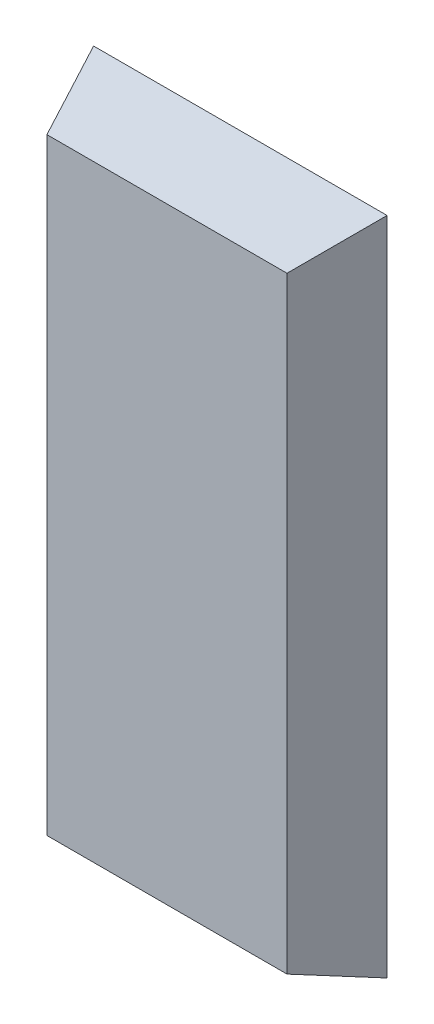
ISO-10303-21;
HEADER;
FILE_DESCRIPTION(('STEP AP214'),'2;1');
FILE_NAME('part.step','',(''),(''),'','','');
FILE_SCHEMA(('AUTOMOTIVE_DESIGN { 1 0 10303 214 1 1 1 1 }'));
ENDSEC;
DATA;
#1=APPLICATION_CONTEXT('core data for automotive mechanical design processes');
#2=APPLICATION_PROTOCOL_DEFINITION('international standard','automotive_design',2000,#1);
#3=PRODUCT_CONTEXT('',#1,'mechanical');
#4=PRODUCT('Part','Part','',(#3));
#5=PRODUCT_RELATED_PRODUCT_CATEGORY('part','',(#4));
#6=PRODUCT_DEFINITION_FORMATION('','',#4);
#7=PRODUCT_DEFINITION_CONTEXT('part definition',#1,'design');
#8=PRODUCT_DEFINITION('design','',#6,#7);
#9=PRODUCT_DEFINITION_SHAPE('','',#8);
#10=(LENGTH_UNIT() NAMED_UNIT(*) SI_UNIT(.MILLI.,.METRE.));
#11=(NAMED_UNIT(*) PLANE_ANGLE_UNIT() SI_UNIT($,.RADIAN.));
#12=(NAMED_UNIT(*) SI_UNIT($,.STERADIAN.) SOLID_ANGLE_UNIT());
#13=UNCERTAINTY_MEASURE_WITH_UNIT(LENGTH_MEASURE(1.E-05),#10,'distance_accuracy_value','');
#14=(GEOMETRIC_REPRESENTATION_CONTEXT(3) GLOBAL_UNCERTAINTY_ASSIGNED_CONTEXT((#13)) GLOBAL_UNIT_ASSIGNED_CONTEXT((#10,
#11,#12)) REPRESENTATION_CONTEXT('',''));
#15=CARTESIAN_POINT('',(0.,0.,0.));
#16=DIRECTION('',(0.,0.,1.));
#17=DIRECTION('',(1.,0.,0.));
#18=AXIS2_PLACEMENT_3D('',#15,#16,#17);
#19=CARTESIAN_POINT('',(10.,22.5,0.));
#20=DIRECTION('',(0.939692620785908,0.,0.342020143325669));
#21=DIRECTION('',(0.342020143325669,0.,-0.939692620785908));
#22=AXIS2_PLACEMENT_3D('',#19,#20,#21);
#23=PLANE('',#22);
#24=DIRECTION('',(0.,1.,0.));
#25=VECTOR('',#24,1.);
#26=CARTESIAN_POINT('',(10.,22.5,0.));
#27=LINE('',#26,#25);
#28=CARTESIAN_POINT('',(10.,-22.5,0.));
#29=VERTEX_POINT('',#28);
#30=CARTESIAN_POINT('',(10.,22.5,0.));
#31=VERTEX_POINT('',#30);
#32=EDGE_CURVE('E86',#29,#31,#27,.T.);
#33=ORIENTED_EDGE('',*,*,#32,.T.);
#34=DIRECTION('',(0.323615577118185,0.323615577118185,-0.889126490715988));
#35=VECTOR('',#34,1.);
#36=CARTESIAN_POINT('',(7.90545916492928,20.4054591649293,5.75470364848242));
#37=LINE('',#36,#35);
#38=CARTESIAN_POINT('',(8.18014882866898,20.680148828669,5.));
#39=VERTEX_POINT('',#38);
#40=EDGE_CURVE('E11',#39,#31,#37,.T.);
#41=ORIENTED_EDGE('',*,*,#40,.F.);
#42=DIRECTION('',(0.,-1.,0.));
#43=VECTOR('',#42,1.);
#44=CARTESIAN_POINT('',(8.18014882866898,22.5,5.));
#45=LINE('',#44,#43);
#46=CARTESIAN_POINT('',(8.18014882866899,-20.680148828669,5.));
#47=VERTEX_POINT('',#46);
#48=EDGE_CURVE('E106',#47,#39,#45,.F.);
#49=ORIENTED_EDGE('',*,*,#48,.F.);
#50=DIRECTION('',(0.323615577118185,-0.323615577118185,-0.889126490715988));
#51=VECTOR('',#50,1.);
#52=CARTESIAN_POINT('',(5.28728312109088,-17.7872831210909,12.9480832090855));
#53=LINE('',#52,#51);
#54=EDGE_CURVE('E98',#47,#29,#53,.T.);
#55=ORIENTED_EDGE('',*,*,#54,.T.);
#56=EDGE_LOOP('',(#33,#41,#49,#55));
#57=FACE_BOUND('',#56,.T.);
#58=ADVANCED_FACE('F39',(#57),#23,.T.);
#59=CARTESIAN_POINT('',(-10.,22.5,0.));
#60=DIRECTION('',(0.,0.939692620785908,0.342020143325669));
#61=DIRECTION('',(0.,-0.342020143325669,0.939692620785908));
#62=AXIS2_PLACEMENT_3D('',#59,#60,#61);
#63=PLANE('',#62);
#64=DIRECTION('',(-1.,0.,0.));
#65=VECTOR('',#64,1.);
#66=CARTESIAN_POINT('',(-10.,22.5,0.));
#67=LINE('',#66,#65);
#68=CARTESIAN_POINT('',(-10.,22.5,0.));
#69=VERTEX_POINT('',#68);
#70=EDGE_CURVE('E82',#31,#69,#67,.T.);
#71=ORIENTED_EDGE('',*,*,#70,.T.);
#72=DIRECTION('',(-0.323615577118185,0.323615577118185,-0.889126490715988));
#73=VECTOR('',#72,1.);
#74=CARTESIAN_POINT('',(-10.,22.5,0.));
#75=LINE('',#74,#73);
#76=CARTESIAN_POINT('',(-8.18014882866898,20.680148828669,5.));
#77=VERTEX_POINT('',#76);
#78=EDGE_CURVE('E49',#77,#69,#75,.T.);
#79=ORIENTED_EDGE('',*,*,#78,.F.);
#80=DIRECTION('',(1.,0.,0.));
#81=VECTOR('',#80,1.);
#82=CARTESIAN_POINT('',(-10.,20.680148828669,5.));
#83=LINE('',#82,#81);
#84=EDGE_CURVE('E94',#39,#77,#83,.F.);
#85=ORIENTED_EDGE('',*,*,#84,.F.);
#86=ORIENTED_EDGE('',*,*,#40,.T.);
#87=EDGE_LOOP('',(#71,#79,#85,#86));
#88=FACE_BOUND('',#87,.T.);
#89=ADVANCED_FACE('F41',(#88),#63,.T.);
#90=CARTESIAN_POINT('',(-10.,22.5,0.));
#91=DIRECTION('',(-0.939692620785908,0.,0.342020143325669));
#92=DIRECTION('',(0.342020143325669,0.,0.939692620785908));
#93=AXIS2_PLACEMENT_3D('',#90,#91,#92);
#94=PLANE('',#93);
#95=DIRECTION('',(0.,-1.,0.));
#96=VECTOR('',#95,1.);
#97=CARTESIAN_POINT('',(-10.,22.5,0.));
#98=LINE('',#97,#96);
#99=CARTESIAN_POINT('',(-10.,-22.5,0.));
#100=VERTEX_POINT('',#99);
#101=EDGE_CURVE('E87',#69,#100,#98,.T.);
#102=ORIENTED_EDGE('',*,*,#101,.T.);
#103=DIRECTION('',(-0.323615577118185,-0.323615577118185,-0.889126490715988));
#104=VECTOR('',#103,1.);
#105=CARTESIAN_POINT('',(-10.,-22.5,0.));
#106=LINE('',#105,#104);
#107=CARTESIAN_POINT('',(-8.18014882866898,-20.680148828669,5.));
#108=VERTEX_POINT('',#107);
#109=EDGE_CURVE('E110',#108,#100,#106,.T.);
#110=ORIENTED_EDGE('',*,*,#109,.F.);
#111=DIRECTION('',(0.,1.,0.));
#112=VECTOR('',#111,1.);
#113=CARTESIAN_POINT('',(-8.18014882866898,22.5,5.));
#114=LINE('',#113,#112);
#115=EDGE_CURVE('E61',#77,#108,#114,.F.);
#116=ORIENTED_EDGE('',*,*,#115,.F.);
#117=ORIENTED_EDGE('',*,*,#78,.T.);
#118=EDGE_LOOP('',(#102,#110,#116,#117));
#119=FACE_BOUND('',#118,.T.);
#120=ADVANCED_FACE('F123',(#119),#94,.T.);
#121=CARTESIAN_POINT('',(-10.,-22.5,0.));
#122=DIRECTION('',(0.,-0.939692620785908,0.342020143325669));
#123=DIRECTION('',(0.,-0.342020143325669,-0.939692620785908));
#124=AXIS2_PLACEMENT_3D('',#121,#122,#123);
#125=PLANE('',#124);
#126=DIRECTION('',(1.,0.,0.));
#127=VECTOR('',#126,1.);
#128=CARTESIAN_POINT('',(-10.,-22.5,0.));
#129=LINE('',#128,#127);
#130=EDGE_CURVE('E104',#100,#29,#129,.T.);
#131=ORIENTED_EDGE('',*,*,#130,.T.);
#132=ORIENTED_EDGE('',*,*,#54,.F.);
#133=DIRECTION('',(-1.,0.,0.));
#134=VECTOR('',#133,1.);
#135=CARTESIAN_POINT('',(-10.,-20.680148828669,5.));
#136=LINE('',#135,#134);
#137=EDGE_CURVE('E43',#108,#47,#136,.F.);
#138=ORIENTED_EDGE('',*,*,#137,.F.);
#139=ORIENTED_EDGE('',*,*,#109,.T.);
#140=EDGE_LOOP('',(#131,#132,#138,#139));
#141=FACE_BOUND('',#140,.T.);
#142=ADVANCED_FACE('F125',(#141),#125,.T.);
#143=CARTESIAN_POINT('',(0.,0.,5.));
#144=DIRECTION('',(0.,0.,1.));
#145=DIRECTION('',(1.,0.,0.));
#146=AXIS2_PLACEMENT_3D('',#143,#144,#145);
#147=PLANE('',#146);
#148=ORIENTED_EDGE('',*,*,#48,.T.);
#149=ORIENTED_EDGE('',*,*,#84,.T.);
#150=ORIENTED_EDGE('',*,*,#115,.T.);
#151=ORIENTED_EDGE('',*,*,#137,.T.);
#152=EDGE_LOOP('',(#148,#149,#150,#151));
#153=FACE_BOUND('',#152,.T.);
#154=ADVANCED_FACE('F121',(#153),#147,.T.);
#155=CARTESIAN_POINT('',(0.,0.,0.));
#156=DIRECTION('',(0.,0.,1.));
#157=DIRECTION('',(1.,0.,0.));
#158=AXIS2_PLACEMENT_3D('',#155,#156,#157);
#159=PLANE('',#158);
#160=ORIENTED_EDGE('',*,*,#32,.F.);
#161=ORIENTED_EDGE('',*,*,#130,.F.);
#162=ORIENTED_EDGE('',*,*,#101,.F.);
#163=ORIENTED_EDGE('',*,*,#70,.F.);
#164=EDGE_LOOP('',(#160,#161,#162,#163));
#165=FACE_BOUND('',#164,.T.);
#166=ADVANCED_FACE('F83',(#165),#159,.F.);
#167=CLOSED_SHELL('',(#58,#89,#120,#142,#154,#166));
#168=MANIFOLD_SOLID_BREP('B2',#167);
#169=ADVANCED_BREP_SHAPE_REPRESENTATION('',(#18,#168),#14);
#170=SHAPE_DEFINITION_REPRESENTATION(#9,#169);
ENDSEC;
END-ISO-10303-21;
